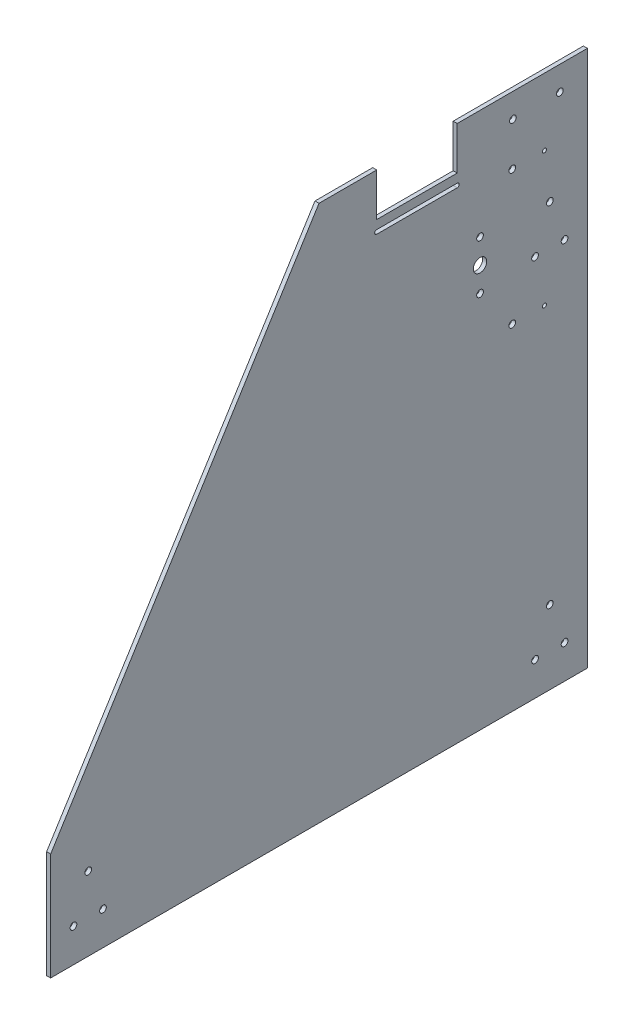
ISO-10303-21;
HEADER;
FILE_DESCRIPTION(('STEP AP214'),'2;1');
FILE_NAME('part.step','',(''),(''),'','','');
FILE_SCHEMA(('AUTOMOTIVE_DESIGN { 1 0 10303 214 1 1 1 1 }'));
ENDSEC;
DATA;
#1=APPLICATION_CONTEXT('core data for automotive mechanical design processes');
#2=APPLICATION_PROTOCOL_DEFINITION('international standard','automotive_design',2000,#1);
#3=PRODUCT_CONTEXT('',#1,'mechanical');
#4=PRODUCT('Part','Part','',(#3));
#5=PRODUCT_RELATED_PRODUCT_CATEGORY('part','',(#4));
#6=PRODUCT_DEFINITION_FORMATION('','',#4);
#7=PRODUCT_DEFINITION_CONTEXT('part definition',#1,'design');
#8=PRODUCT_DEFINITION('design','',#6,#7);
#9=PRODUCT_DEFINITION_SHAPE('','',#8);
#10=(LENGTH_UNIT() NAMED_UNIT(*) SI_UNIT(.MILLI.,.METRE.));
#11=(NAMED_UNIT(*) PLANE_ANGLE_UNIT() SI_UNIT($,.RADIAN.));
#12=(NAMED_UNIT(*) SI_UNIT($,.STERADIAN.) SOLID_ANGLE_UNIT());
#13=UNCERTAINTY_MEASURE_WITH_UNIT(LENGTH_MEASURE(1.E-05),#10,'distance_accuracy_value','');
#14=(GEOMETRIC_REPRESENTATION_CONTEXT(3) GLOBAL_UNCERTAINTY_ASSIGNED_CONTEXT((#13)) GLOBAL_UNIT_ASSIGNED_CONTEXT((#10,
#11,#12)) REPRESENTATION_CONTEXT('',''));
#15=CARTESIAN_POINT('',(0.,0.,0.));
#16=DIRECTION('',(0.,0.,1.));
#17=DIRECTION('',(1.,0.,0.));
#18=AXIS2_PLACEMENT_3D('',#15,#16,#17);
#19=CARTESIAN_POINT('',(5.,400.,-200.));
#20=DIRECTION('',(0.,1.,0.));
#21=DIRECTION('',(0.,0.,1.));
#22=AXIS2_PLACEMENT_3D('',#19,#20,#21);
#23=PLANE('',#22);
#24=DIRECTION('',(1.,0.,0.));
#25=VECTOR('',#24,1.);
#26=CARTESIAN_POINT('',(2.,400.,-303.));
#27=LINE('',#26,#25);
#28=CARTESIAN_POINT('',(2.,400.,-303.));
#29=VERTEX_POINT('',#28);
#30=CARTESIAN_POINT('',(5.,400.,-303.));
#31=VERTEX_POINT('',#30);
#32=EDGE_CURVE('E133',#29,#31,#27,.T.);
#33=ORIENTED_EDGE('',*,*,#32,.T.);
#34=DIRECTION('',(0.,0.,1.));
#35=VECTOR('',#34,1.);
#36=CARTESIAN_POINT('',(5.,400.,-200.));
#37=LINE('',#36,#35);
#38=CARTESIAN_POINT('',(5.,400.,-400.));
#39=VERTEX_POINT('',#38);
#40=EDGE_CURVE('E193',#39,#31,#37,.T.);
#41=ORIENTED_EDGE('',*,*,#40,.F.);
#42=DIRECTION('',(1.,0.,0.));
#43=VECTOR('',#42,1.);
#44=CARTESIAN_POINT('',(5.,400.,-400.));
#45=LINE('',#44,#43);
#46=CARTESIAN_POINT('',(2.,400.,-400.));
#47=VERTEX_POINT('',#46);
#48=EDGE_CURVE('E47',#47,#39,#45,.T.);
#49=ORIENTED_EDGE('',*,*,#48,.F.);
#50=DIRECTION('',(0.,0.,-1.));
#51=VECTOR('',#50,1.);
#52=CARTESIAN_POINT('',(2.,400.,0.));
#53=LINE('',#52,#51);
#54=EDGE_CURVE('E150',#47,#29,#53,.F.);
#55=ORIENTED_EDGE('',*,*,#54,.T.);
#56=EDGE_LOOP('',(#33,#41,#49,#55));
#57=FACE_BOUND('',#56,.T.);
#58=ADVANCED_FACE('F38',(#57),#23,.T.);
#59=CARTESIAN_POINT('',(5.,0.,-400.));
#60=DIRECTION('',(0.,0.,-1.));
#61=DIRECTION('',(0.,1.,0.));
#62=AXIS2_PLACEMENT_3D('',#59,#60,#61);
#63=PLANE('',#62);
#64=DIRECTION('',(1.,0.,0.));
#65=VECTOR('',#64,1.);
#66=CARTESIAN_POINT('',(5.,0.,-400.));
#67=LINE('',#66,#65);
#68=CARTESIAN_POINT('',(2.,0.,-400.));
#69=VERTEX_POINT('',#68);
#70=CARTESIAN_POINT('',(5.,0.,-400.));
#71=VERTEX_POINT('',#70);
#72=EDGE_CURVE('E11',#69,#71,#67,.T.);
#73=ORIENTED_EDGE('',*,*,#72,.F.);
#74=DIRECTION('',(0.,1.,0.));
#75=VECTOR('',#74,1.);
#76=CARTESIAN_POINT('',(2.,0.,-400.));
#77=LINE('',#76,#75);
#78=EDGE_CURVE('E162',#69,#47,#77,.T.);
#79=ORIENTED_EDGE('',*,*,#78,.T.);
#80=ORIENTED_EDGE('',*,*,#48,.T.);
#81=DIRECTION('',(0.,1.,0.));
#82=VECTOR('',#81,1.);
#83=CARTESIAN_POINT('',(5.,0.,-400.));
#84=LINE('',#83,#82);
#85=EDGE_CURVE('E188',#71,#39,#84,.T.);
#86=ORIENTED_EDGE('',*,*,#85,.F.);
#87=EDGE_LOOP('',(#73,#79,#80,#86));
#88=FACE_BOUND('',#87,.T.);
#89=ADVANCED_FACE('F187',(#88),#63,.T.);
#90=DIRECTION('',(1.,0.,0.));
#91=VECTOR('',#90,1.);
#92=CARTESIAN_POINT('',(2.,400.,-243.));
#93=LINE('',#92,#91);
#94=CARTESIAN_POINT('',(2.,400.,-243.));
#95=VERTEX_POINT('',#94);
#96=CARTESIAN_POINT('',(5.,400.,-243.));
#97=VERTEX_POINT('',#96);
#98=EDGE_CURVE('E143',#95,#97,#93,.T.);
#99=ORIENTED_EDGE('',*,*,#98,.F.);
#100=CARTESIAN_POINT('',(2.,400.,-200.));
#101=VERTEX_POINT('',#100);
#102=EDGE_CURVE('E157',#95,#101,#53,.F.);
#103=ORIENTED_EDGE('',*,*,#102,.T.);
#104=DIRECTION('',(1.,0.,0.));
#105=VECTOR('',#104,1.);
#106=CARTESIAN_POINT('',(5.,400.,-200.));
#107=LINE('',#106,#105);
#108=CARTESIAN_POINT('',(5.,400.,-200.));
#109=VERTEX_POINT('',#108);
#110=EDGE_CURVE('E181',#101,#109,#107,.T.);
#111=ORIENTED_EDGE('',*,*,#110,.T.);
#112=EDGE_CURVE('E197',#97,#109,#37,.T.);
#113=ORIENTED_EDGE('',*,*,#112,.F.);
#114=EDGE_LOOP('',(#99,#103,#111,#113));
#115=FACE_BOUND('',#114,.T.);
#116=ADVANCED_FACE('F235',(#115),#23,.T.);
#117=CARTESIAN_POINT('',(5.,80.,0.));
#118=DIRECTION('',(0.,0.52999894000318,0.847998304005088));
#119=DIRECTION('',(0.,-0.847998304005088,0.52999894000318));
#120=AXIS2_PLACEMENT_3D('',#117,#118,#119);
#121=PLANE('',#120);
#122=ORIENTED_EDGE('',*,*,#110,.F.);
#123=DIRECTION('',(0.,-0.847998304005088,0.52999894000318));
#124=VECTOR('',#123,1.);
#125=CARTESIAN_POINT('',(2.,80.,0.));
#126=LINE('',#125,#124);
#127=CARTESIAN_POINT('',(2.,80.,0.));
#128=VERTEX_POINT('',#127);
#129=EDGE_CURVE('E156',#101,#128,#126,.T.);
#130=ORIENTED_EDGE('',*,*,#129,.T.);
#131=DIRECTION('',(1.,0.,0.));
#132=VECTOR('',#131,1.);
#133=CARTESIAN_POINT('',(5.,80.,0.));
#134=LINE('',#133,#132);
#135=CARTESIAN_POINT('',(5.,80.,0.));
#136=VERTEX_POINT('',#135);
#137=EDGE_CURVE('E179',#128,#136,#134,.T.);
#138=ORIENTED_EDGE('',*,*,#137,.T.);
#139=DIRECTION('',(0.,-0.847998304005088,0.52999894000318));
#140=VECTOR('',#139,1.);
#141=CARTESIAN_POINT('',(5.,80.,0.));
#142=LINE('',#141,#140);
#143=EDGE_CURVE('E199',#109,#136,#142,.T.);
#144=ORIENTED_EDGE('',*,*,#143,.F.);
#145=EDGE_LOOP('',(#122,#130,#138,#144));
#146=FACE_BOUND('',#145,.T.);
#147=ADVANCED_FACE('F230',(#146),#121,.T.);
#148=CARTESIAN_POINT('',(5.,80.,0.));
#149=DIRECTION('',(0.,0.,1.));
#150=DIRECTION('',(0.,-1.,0.));
#151=AXIS2_PLACEMENT_3D('',#148,#149,#150);
#152=PLANE('',#151);
#153=ORIENTED_EDGE('',*,*,#137,.F.);
#154=DIRECTION('',(0.,1.,0.));
#155=VECTOR('',#154,1.);
#156=CARTESIAN_POINT('',(2.,0.,0.));
#157=LINE('',#156,#155);
#158=CARTESIAN_POINT('',(2.,0.,0.));
#159=VERTEX_POINT('',#158);
#160=EDGE_CURVE('E169',#128,#159,#157,.F.);
#161=ORIENTED_EDGE('',*,*,#160,.T.);
#162=DIRECTION('',(1.,0.,0.));
#163=VECTOR('',#162,1.);
#164=CARTESIAN_POINT('',(5.,0.,0.));
#165=LINE('',#164,#163);
#166=CARTESIAN_POINT('',(5.,0.,0.));
#167=VERTEX_POINT('',#166);
#168=EDGE_CURVE('E42',#159,#167,#165,.T.);
#169=ORIENTED_EDGE('',*,*,#168,.T.);
#170=DIRECTION('',(0.,-1.,0.));
#171=VECTOR('',#170,1.);
#172=CARTESIAN_POINT('',(5.,80.,0.));
#173=LINE('',#172,#171);
#174=EDGE_CURVE('E363',#136,#167,#173,.T.);
#175=ORIENTED_EDGE('',*,*,#174,.F.);
#176=EDGE_LOOP('',(#153,#161,#169,#175));
#177=FACE_BOUND('',#176,.T.);
#178=ADVANCED_FACE('F223',(#177),#152,.T.);
#179=CARTESIAN_POINT('',(5.,250.,-344.));
#180=DIRECTION('',(1.,0.,0.));
#181=DIRECTION('',(0.,0.,-1.));
#182=AXIS2_PLACEMENT_3D('',#179,#180,#181);
#183=CYLINDRICAL_SURFACE('',#182,2.50000000000002);
#184=CARTESIAN_POINT('',(5.,250.,-344.));
#185=DIRECTION('',(1.,0.,0.));
#186=DIRECTION('',(0.,0.,-1.));
#187=AXIS2_PLACEMENT_3D('',#184,#185,#186);
#188=CIRCLE('',#187,2.50000000000002);
#189=CARTESIAN_POINT('',(5.,250.,-346.5));
#190=VERTEX_POINT('',#189);
#191=EDGE_CURVE('E178',#190,#190,#188,.T.);
#192=ORIENTED_EDGE('',*,*,#191,.T.);
#193=EDGE_LOOP('',(#192));
#194=FACE_BOUND('',#193,.T.);
#195=CARTESIAN_POINT('',(2.,250.,-344.));
#196=DIRECTION('',(1.,0.,0.));
#197=DIRECTION('',(0.,0.,-1.));
#198=AXIS2_PLACEMENT_3D('',#195,#196,#197);
#199=CIRCLE('',#198,2.50000000000002);
#200=CARTESIAN_POINT('',(2.,250.,-346.5));
#201=VERTEX_POINT('',#200);
#202=EDGE_CURVE('E214',#201,#201,#199,.T.);
#203=ORIENTED_EDGE('',*,*,#202,.F.);
#204=EDGE_LOOP('',(#203));
#205=FACE_BOUND('',#204,.T.);
#206=ADVANCED_FACE('F377',(#194,#205),#183,.F.);
#207=CARTESIAN_POINT('',(5.,281.75,-320.));
#208=DIRECTION('',(1.,0.,0.));
#209=DIRECTION('',(0.,0.,-1.));
#210=AXIS2_PLACEMENT_3D('',#207,#208,#209);
#211=CYLINDRICAL_SURFACE('',#210,2.50000000000002);
#212=CARTESIAN_POINT('',(5.,281.75,-320.));
#213=DIRECTION('',(1.,0.,0.));
#214=DIRECTION('',(0.,0.,1.));
#215=AXIS2_PLACEMENT_3D('',#212,#213,#214);
#216=CIRCLE('',#215,2.50000000000002);
#217=CARTESIAN_POINT('',(5.,281.75,-317.5));
#218=VERTEX_POINT('',#217);
#219=EDGE_CURVE('E360',#218,#218,#216,.T.);
#220=ORIENTED_EDGE('',*,*,#219,.T.);
#221=EDGE_LOOP('',(#220));
#222=FACE_BOUND('',#221,.T.);
#223=CARTESIAN_POINT('',(2.,281.75,-320.));
#224=DIRECTION('',(1.,0.,0.));
#225=DIRECTION('',(0.,0.,-1.));
#226=AXIS2_PLACEMENT_3D('',#223,#224,#225);
#227=CIRCLE('',#226,2.50000000000002);
#228=CARTESIAN_POINT('',(2.,281.75,-322.5));
#229=VERTEX_POINT('',#228);
#230=EDGE_CURVE('E217',#229,#229,#227,.T.);
#231=ORIENTED_EDGE('',*,*,#230,.F.);
#232=EDGE_LOOP('',(#231));
#233=FACE_BOUND('',#232,.T.);
#234=ADVANCED_FACE('F368',(#222,#233),#211,.F.);
#235=CARTESIAN_POINT('',(5.,0.,0.));
#236=DIRECTION('',(0.,-1.,0.));
#237=DIRECTION('',(0.,0.,-1.));
#238=AXIS2_PLACEMENT_3D('',#235,#236,#237);
#239=PLANE('',#238);
#240=DIRECTION('',(0.,0.,-1.));
#241=VECTOR('',#240,1.);
#242=CARTESIAN_POINT('',(2.,0.,0.));
#243=LINE('',#242,#241);
#244=EDGE_CURVE('E166',#159,#69,#243,.T.);
#245=ORIENTED_EDGE('',*,*,#244,.T.);
#246=ORIENTED_EDGE('',*,*,#72,.T.);
#247=DIRECTION('',(0.,0.,-1.));
#248=VECTOR('',#247,1.);
#249=CARTESIAN_POINT('',(5.,0.,0.));
#250=LINE('',#249,#248);
#251=EDGE_CURVE('E196',#167,#71,#250,.T.);
#252=ORIENTED_EDGE('',*,*,#251,.F.);
#253=ORIENTED_EDGE('',*,*,#168,.F.);
#254=EDGE_LOOP('',(#245,#246,#252,#253));
#255=FACE_BOUND('',#254,.T.);
#256=ADVANCED_FACE('F365',(#255),#239,.T.);
#257=CARTESIAN_POINT('',(5.,318.25,-320.));
#258=DIRECTION('',(1.,0.,0.));
#259=DIRECTION('',(0.,0.,-1.));
#260=AXIS2_PLACEMENT_3D('',#257,#258,#259);
#261=CYLINDRICAL_SURFACE('',#260,2.50000000000002);
#262=CARTESIAN_POINT('',(5.,318.25,-320.));
#263=DIRECTION('',(1.,0.,0.));
#264=DIRECTION('',(0.,0.,-1.));
#265=AXIS2_PLACEMENT_3D('',#262,#263,#264);
#266=CIRCLE('',#265,2.50000000000002);
#267=CARTESIAN_POINT('',(5.,318.25,-322.5));
#268=VERTEX_POINT('',#267);
#269=EDGE_CURVE('E202',#268,#268,#266,.T.);
#270=ORIENTED_EDGE('',*,*,#269,.T.);
#271=EDGE_LOOP('',(#270));
#272=FACE_BOUND('',#271,.T.);
#273=CARTESIAN_POINT('',(2.,318.25,-320.));
#274=DIRECTION('',(1.,0.,0.));
#275=DIRECTION('',(0.,0.,-1.));
#276=AXIS2_PLACEMENT_3D('',#273,#274,#275);
#277=CIRCLE('',#276,2.50000000000002);
#278=CARTESIAN_POINT('',(2.,318.25,-322.5));
#279=VERTEX_POINT('',#278);
#280=EDGE_CURVE('E160',#279,#279,#277,.T.);
#281=ORIENTED_EDGE('',*,*,#280,.F.);
#282=EDGE_LOOP('',(#281));
#283=FACE_BOUND('',#282,.T.);
#284=ADVANCED_FACE('F367',(#272,#283),#261,.F.);
#285=CARTESIAN_POINT('',(5.,350.,-344.));
#286=DIRECTION('',(1.,0.,0.));
#287=DIRECTION('',(0.,0.,-1.));
#288=AXIS2_PLACEMENT_3D('',#285,#286,#287);
#289=CYLINDRICAL_SURFACE('',#288,2.50000000000002);
#290=CARTESIAN_POINT('',(5.,350.,-344.));
#291=DIRECTION('',(1.,0.,0.));
#292=DIRECTION('',(0.,0.,-1.));
#293=AXIS2_PLACEMENT_3D('',#290,#291,#292);
#294=CIRCLE('',#293,2.50000000000002);
#295=CARTESIAN_POINT('',(5.,350.,-346.5));
#296=VERTEX_POINT('',#295);
#297=EDGE_CURVE('E208',#296,#296,#294,.T.);
#298=ORIENTED_EDGE('',*,*,#297,.T.);
#299=EDGE_LOOP('',(#298));
#300=FACE_BOUND('',#299,.T.);
#301=CARTESIAN_POINT('',(2.,350.,-344.));
#302=DIRECTION('',(1.,0.,0.));
#303=DIRECTION('',(0.,0.,-1.));
#304=AXIS2_PLACEMENT_3D('',#301,#302,#303);
#305=CIRCLE('',#304,2.50000000000002);
#306=CARTESIAN_POINT('',(2.,350.,-346.5));
#307=VERTEX_POINT('',#306);
#308=EDGE_CURVE('E172',#307,#307,#305,.T.);
#309=ORIENTED_EDGE('',*,*,#308,.F.);
#310=EDGE_LOOP('',(#309));
#311=FACE_BOUND('',#310,.T.);
#312=ADVANCED_FACE('F374',(#300,#311),#289,.F.);
#313=CARTESIAN_POINT('',(5.,300.,-320.));
#314=DIRECTION('',(1.,0.,0.));
#315=DIRECTION('',(0.,0.,-1.));
#316=AXIS2_PLACEMENT_3D('',#313,#314,#315);
#317=CYLINDRICAL_SURFACE('',#316,4.99999999999999);
#318=CARTESIAN_POINT('',(5.,300.,-320.));
#319=DIRECTION('',(1.,0.,0.));
#320=DIRECTION('',(0.,0.,-1.));
#321=AXIS2_PLACEMENT_3D('',#318,#319,#320);
#322=CIRCLE('',#321,4.99999999999999);
#323=CARTESIAN_POINT('',(5.,300.,-325.));
#324=VERTEX_POINT('',#323);
#325=EDGE_CURVE('E211',#324,#324,#322,.T.);
#326=ORIENTED_EDGE('',*,*,#325,.T.);
#327=EDGE_LOOP('',(#326));
#328=FACE_BOUND('',#327,.T.);
#329=CARTESIAN_POINT('',(2.,300.,-320.));
#330=DIRECTION('',(1.,0.,0.));
#331=DIRECTION('',(0.,0.,-1.));
#332=AXIS2_PLACEMENT_3D('',#329,#330,#331);
#333=CIRCLE('',#332,4.99999999999999);
#334=CARTESIAN_POINT('',(2.,300.,-325.));
#335=VERTEX_POINT('',#334);
#336=EDGE_CURVE('E175',#335,#335,#333,.T.);
#337=ORIENTED_EDGE('',*,*,#336,.F.);
#338=EDGE_LOOP('',(#337));
#339=FACE_BOUND('',#338,.T.);
#340=ADVANCED_FACE('F40',(#328,#339),#317,.F.);
#341=CARTESIAN_POINT('',(5.,0.,0.));
#342=DIRECTION('',(1.,0.,0.));
#343=DIRECTION('',(0.,0.,-1.));
#344=AXIS2_PLACEMENT_3D('',#341,#342,#343);
#345=PLANE('',#344);
#346=DIRECTION('',(0.,1.,0.));
#347=VECTOR('',#346,1.);
#348=CARTESIAN_POINT('',(5.,368.,-303.));
#349=LINE('',#348,#347);
#350=CARTESIAN_POINT('',(5.,368.,-303.));
#351=VERTEX_POINT('',#350);
#352=EDGE_CURVE('E138',#351,#31,#349,.T.);
#353=ORIENTED_EDGE('',*,*,#352,.F.);
#354=DIRECTION('',(0.,0.,-1.));
#355=VECTOR('',#354,1.);
#356=CARTESIAN_POINT('',(5.,368.,-303.));
#357=LINE('',#356,#355);
#358=CARTESIAN_POINT('',(5.,368.,-243.));
#359=VERTEX_POINT('',#358);
#360=EDGE_CURVE('E154',#359,#351,#357,.T.);
#361=ORIENTED_EDGE('',*,*,#360,.F.);
#362=DIRECTION('',(0.,-1.,0.));
#363=VECTOR('',#362,1.);
#364=CARTESIAN_POINT('',(5.,368.,-243.));
#365=LINE('',#364,#363);
#366=EDGE_CURVE('E241',#97,#359,#365,.T.);
#367=ORIENTED_EDGE('',*,*,#366,.F.);
#368=ORIENTED_EDGE('',*,*,#112,.T.);
#369=ORIENTED_EDGE('',*,*,#143,.T.);
#370=ORIENTED_EDGE('',*,*,#174,.T.);
#371=ORIENTED_EDGE('',*,*,#251,.T.);
#372=ORIENTED_EDGE('',*,*,#85,.T.);
#373=ORIENTED_EDGE('',*,*,#40,.T.);
#374=EDGE_LOOP('',(#353,#361,#367,#368,#369,#370,#371,#372,#373));
#375=FACE_BOUND('',#374,.T.);
#376=CARTESIAN_POINT('',(5.,360.,-243.));
#377=DIRECTION('',(1.,0.,0.));
#378=DIRECTION('',(0.,0.,-1.));
#379=AXIS2_PLACEMENT_3D('',#376,#377,#378);
#380=CIRCLE('',#379,1.5);
#381=CARTESIAN_POINT('',(5.,361.5,-243.));
#382=VERTEX_POINT('',#381);
#383=CARTESIAN_POINT('',(5.,358.5,-243.));
#384=VERTEX_POINT('',#383);
#385=EDGE_CURVE('E54',#382,#384,#380,.T.);
#386=ORIENTED_EDGE('',*,*,#385,.F.);
#387=DIRECTION('',(0.,0.,1.));
#388=VECTOR('',#387,1.);
#389=CARTESIAN_POINT('',(5.,361.5,-243.));
#390=LINE('',#389,#388);
#391=CARTESIAN_POINT('',(5.,361.5,-303.));
#392=VERTEX_POINT('',#391);
#393=EDGE_CURVE('E257',#392,#382,#390,.T.);
#394=ORIENTED_EDGE('',*,*,#393,.F.);
#395=CARTESIAN_POINT('',(5.,360.,-303.));
#396=DIRECTION('',(1.,0.,0.));
#397=DIRECTION('',(0.,0.,-1.));
#398=AXIS2_PLACEMENT_3D('',#395,#396,#397);
#399=CIRCLE('',#398,1.5);
#400=CARTESIAN_POINT('',(5.,358.5,-303.));
#401=VERTEX_POINT('',#400);
#402=EDGE_CURVE('E271',#401,#392,#399,.T.);
#403=ORIENTED_EDGE('',*,*,#402,.F.);
#404=DIRECTION('',(0.,0.,-1.));
#405=VECTOR('',#404,1.);
#406=CARTESIAN_POINT('',(5.,358.5,-243.));
#407=LINE('',#406,#405);
#408=EDGE_CURVE('E268',#384,#401,#407,.T.);
#409=ORIENTED_EDGE('',*,*,#408,.F.);
#410=EDGE_LOOP('',(#386,#394,#403,#409));
#411=FACE_BOUND('',#410,.T.);
#412=CARTESIAN_POINT('',(5.,349.999999999988,-368.000000000012));
#413=DIRECTION('',(-1.,0.,0.));
#414=DIRECTION('',(0.,0.,1.));
#415=AXIS2_PLACEMENT_3D('',#412,#413,#414);
#416=CIRCLE('',#415,1.50000000000002);
#417=CARTESIAN_POINT('',(5.,349.999999999988,-366.500000000012));
#418=VERTEX_POINT('',#417);
#419=EDGE_CURVE('E282',#418,#418,#416,.T.);
#420=ORIENTED_EDGE('',*,*,#419,.T.);
#421=EDGE_LOOP('',(#420));
#422=FACE_BOUND('',#421,.T.);
#423=CARTESIAN_POINT('',(5.,249.999999999988,-368.000000000009));
#424=DIRECTION('',(-1.,0.,0.));
#425=DIRECTION('',(0.,0.,1.));
#426=AXIS2_PLACEMENT_3D('',#423,#424,#425);
#427=CIRCLE('',#426,1.50000000000002);
#428=CARTESIAN_POINT('',(5.,249.999999999988,-366.500000000009));
#429=VERTEX_POINT('',#428);
#430=EDGE_CURVE('E289',#429,#429,#427,.T.);
#431=ORIENTED_EDGE('',*,*,#430,.T.);
#432=EDGE_LOOP('',(#431));
#433=FACE_BOUND('',#432,.T.);
#434=CARTESIAN_POINT('',(5.,382.,-344.499999999998));
#435=DIRECTION('',(-1.,0.,0.));
#436=DIRECTION('',(0.,0.,1.));
#437=AXIS2_PLACEMENT_3D('',#434,#435,#436);
#438=CIRCLE('',#437,2.50000000000002);
#439=CARTESIAN_POINT('',(5.,382.,-341.999999999998));
#440=VERTEX_POINT('',#439);
#441=EDGE_CURVE('E294',#440,#440,#438,.T.);
#442=ORIENTED_EDGE('',*,*,#441,.T.);
#443=EDGE_LOOP('',(#442));
#444=FACE_BOUND('',#443,.T.);
#445=CARTESIAN_POINT('',(5.,382.,-379.499999999998));
#446=DIRECTION('',(-1.,0.,0.));
#447=DIRECTION('',(0.,0.,1.));
#448=AXIS2_PLACEMENT_3D('',#445,#446,#447);
#449=CIRCLE('',#448,2.50000000000002);
#450=CARTESIAN_POINT('',(5.,382.,-376.999999999998));
#451=VERTEX_POINT('',#450);
#452=EDGE_CURVE('E301',#451,#451,#449,.T.);
#453=ORIENTED_EDGE('',*,*,#452,.T.);
#454=EDGE_LOOP('',(#453));
#455=FACE_BOUND('',#454,.T.);
#456=CARTESIAN_POINT('',(5.,315.,-371.999999999997));
#457=DIRECTION('',(-1.,0.,0.));
#458=DIRECTION('',(0.,0.,1.));
#459=AXIS2_PLACEMENT_3D('',#456,#457,#458);
#460=CIRCLE('',#459,2.49999999999997);
#461=CARTESIAN_POINT('',(5.,315.,-369.499999999997));
#462=VERTEX_POINT('',#461);
#463=EDGE_CURVE('E306',#462,#462,#460,.T.);
#464=ORIENTED_EDGE('',*,*,#463,.T.);
#465=EDGE_LOOP('',(#464));
#466=FACE_BOUND('',#465,.T.);
#467=CARTESIAN_POINT('',(5.,285.,-360.999999999997));
#468=DIRECTION('',(-1.,0.,0.));
#469=DIRECTION('',(0.,0.,1.));
#470=AXIS2_PLACEMENT_3D('',#467,#468,#469);
#471=CIRCLE('',#470,2.49999999999997);
#472=CARTESIAN_POINT('',(5.,285.,-358.499999999997));
#473=VERTEX_POINT('',#472);
#474=EDGE_CURVE('E313',#473,#473,#471,.T.);
#475=ORIENTED_EDGE('',*,*,#474,.T.);
#476=EDGE_LOOP('',(#475));
#477=FACE_BOUND('',#476,.T.);
#478=CARTESIAN_POINT('',(5.,285.,-382.999999999997));
#479=DIRECTION('',(-1.,0.,0.));
#480=DIRECTION('',(0.,0.,-1.));
#481=AXIS2_PLACEMENT_3D('',#478,#479,#480);
#482=CIRCLE('',#481,2.49999999999997);
#483=CARTESIAN_POINT('',(5.,285.,-385.499999999997));
#484=VERTEX_POINT('',#483);
#485=EDGE_CURVE('E319',#484,#484,#482,.T.);
#486=ORIENTED_EDGE('',*,*,#485,.T.);
#487=EDGE_LOOP('',(#486));
#488=FACE_BOUND('',#487,.T.);
#489=CARTESIAN_POINT('',(5.,55.0000000000013,-372.000000000005));
#490=DIRECTION('',(1.,0.,0.));
#491=DIRECTION('',(0.,0.,1.));
#492=AXIS2_PLACEMENT_3D('',#489,#490,#491);
#493=CIRCLE('',#492,2.49999999999997);
#494=CARTESIAN_POINT('',(5.,55.0000000000013,-369.500000000005));
#495=VERTEX_POINT('',#494);
#496=EDGE_CURVE('E309',#495,#495,#493,.T.);
#497=ORIENTED_EDGE('',*,*,#496,.F.);
#498=EDGE_LOOP('',(#497));
#499=FACE_BOUND('',#498,.T.);
#500=CARTESIAN_POINT('',(5.,25.0000000000014,-361.000000000005));
#501=DIRECTION('',(1.,0.,0.));
#502=DIRECTION('',(0.,0.,1.));
#503=AXIS2_PLACEMENT_3D('',#500,#501,#502);
#504=CIRCLE('',#503,2.49999999999984);
#505=CARTESIAN_POINT('',(5.,25.0000000000014,-358.500000000005));
#506=VERTEX_POINT('',#505);
#507=EDGE_CURVE('E346',#506,#506,#504,.T.);
#508=ORIENTED_EDGE('',*,*,#507,.F.);
#509=EDGE_LOOP('',(#508));
#510=FACE_BOUND('',#509,.T.);
#511=CARTESIAN_POINT('',(5.,25.0000000000014,-383.000000000005));
#512=DIRECTION('',(1.,0.,0.));
#513=DIRECTION('',(0.,0.,-1.));
#514=AXIS2_PLACEMENT_3D('',#511,#512,#513);
#515=CIRCLE('',#514,2.49999999999997);
#516=CARTESIAN_POINT('',(5.,25.0000000000014,-385.500000000005));
#517=VERTEX_POINT('',#516);
#518=EDGE_CURVE('E340',#517,#517,#515,.T.);
#519=ORIENTED_EDGE('',*,*,#518,.F.);
#520=EDGE_LOOP('',(#519));
#521=FACE_BOUND('',#520,.T.);
#522=CARTESIAN_POINT('',(5.,25.,-16.9999999999951));
#523=DIRECTION('',(1.,0.,0.));
#524=DIRECTION('',(0.,0.,1.));
#525=AXIS2_PLACEMENT_3D('',#522,#523,#524);
#526=CIRCLE('',#525,2.50000000000001);
#527=CARTESIAN_POINT('',(5.,25.,-14.4999999999951));
#528=VERTEX_POINT('',#527);
#529=EDGE_CURVE('E334',#528,#528,#526,.T.);
#530=ORIENTED_EDGE('',*,*,#529,.F.);
#531=EDGE_LOOP('',(#530));
#532=FACE_BOUND('',#531,.T.);
#533=CARTESIAN_POINT('',(5.,25.,-38.9999999999949));
#534=DIRECTION('',(1.,0.,0.));
#535=DIRECTION('',(0.,0.,-1.));
#536=AXIS2_PLACEMENT_3D('',#533,#534,#535);
#537=CIRCLE('',#536,2.5);
#538=CARTESIAN_POINT('',(5.,25.,-41.4999999999949));
#539=VERTEX_POINT('',#538);
#540=EDGE_CURVE('E328',#539,#539,#537,.T.);
#541=ORIENTED_EDGE('',*,*,#540,.F.);
#542=EDGE_LOOP('',(#541));
#543=FACE_BOUND('',#542,.T.);
#544=CARTESIAN_POINT('',(5.,55.,-27.9999999999949));
#545=DIRECTION('',(1.,0.,0.));
#546=DIRECTION('',(0.,0.,-1.));
#547=AXIS2_PLACEMENT_3D('',#544,#545,#546);
#548=CIRCLE('',#547,2.5);
#549=CARTESIAN_POINT('',(5.,55.,-30.4999999999949));
#550=VERTEX_POINT('',#549);
#551=EDGE_CURVE('E327',#550,#550,#548,.T.);
#552=ORIENTED_EDGE('',*,*,#551,.F.);
#553=EDGE_LOOP('',(#552));
#554=FACE_BOUND('',#553,.T.);
#555=ORIENTED_EDGE('',*,*,#191,.F.);
#556=EDGE_LOOP('',(#555));
#557=FACE_BOUND('',#556,.T.);
#558=ORIENTED_EDGE('',*,*,#219,.F.);
#559=EDGE_LOOP('',(#558));
#560=FACE_BOUND('',#559,.T.);
#561=ORIENTED_EDGE('',*,*,#269,.F.);
#562=EDGE_LOOP('',(#561));
#563=FACE_BOUND('',#562,.T.);
#564=ORIENTED_EDGE('',*,*,#297,.F.);
#565=EDGE_LOOP('',(#564));
#566=FACE_BOUND('',#565,.T.);
#567=ORIENTED_EDGE('',*,*,#325,.F.);
#568=EDGE_LOOP('',(#567));
#569=FACE_BOUND('',#568,.T.);
#570=ADVANCED_FACE('F191',(#375,#411,#422,#433,#444,#455,#466,#477,#488,#499,#510,#521,#532,
#543,#554,#557,#560,#563,#566,#569),#345,.T.);
#571=CARTESIAN_POINT('',(2.,0.,0.));
#572=DIRECTION('',(1.,0.,0.));
#573=DIRECTION('',(0.,0.,-1.));
#574=AXIS2_PLACEMENT_3D('',#571,#572,#573);
#575=PLANE('',#574);
#576=DIRECTION('',(0.,0.,1.));
#577=VECTOR('',#576,1.);
#578=CARTESIAN_POINT('',(2.,361.5,-243.));
#579=LINE('',#578,#577);
#580=CARTESIAN_POINT('',(2.,361.5,-303.));
#581=VERTEX_POINT('',#580);
#582=CARTESIAN_POINT('',(2.,361.5,-243.));
#583=VERTEX_POINT('',#582);
#584=EDGE_CURVE('E263',#581,#583,#579,.T.);
#585=ORIENTED_EDGE('',*,*,#584,.T.);
#586=CARTESIAN_POINT('',(2.,360.,-243.));
#587=DIRECTION('',(1.,0.,0.));
#588=DIRECTION('',(0.,0.,-1.));
#589=AXIS2_PLACEMENT_3D('',#586,#587,#588);
#590=CIRCLE('',#589,1.5);
#591=CARTESIAN_POINT('',(2.,358.5,-243.));
#592=VERTEX_POINT('',#591);
#593=EDGE_CURVE('E253',#583,#592,#590,.T.);
#594=ORIENTED_EDGE('',*,*,#593,.T.);
#595=DIRECTION('',(0.,0.,-1.));
#596=VECTOR('',#595,1.);
#597=CARTESIAN_POINT('',(2.,358.5,-243.));
#598=LINE('',#597,#596);
#599=CARTESIAN_POINT('',(2.,358.5,-303.));
#600=VERTEX_POINT('',#599);
#601=EDGE_CURVE('E256',#592,#600,#598,.T.);
#602=ORIENTED_EDGE('',*,*,#601,.T.);
#603=CARTESIAN_POINT('',(2.,360.,-303.));
#604=DIRECTION('',(1.,0.,0.));
#605=DIRECTION('',(0.,0.,-1.));
#606=AXIS2_PLACEMENT_3D('',#603,#604,#605);
#607=CIRCLE('',#606,1.5);
#608=EDGE_CURVE('E260',#600,#581,#607,.T.);
#609=ORIENTED_EDGE('',*,*,#608,.T.);
#610=EDGE_LOOP('',(#585,#594,#602,#609));
#611=FACE_BOUND('',#610,.T.);
#612=CARTESIAN_POINT('',(2.,349.999999999988,-368.000000000012));
#613=DIRECTION('',(-1.,0.,0.));
#614=DIRECTION('',(0.,0.,1.));
#615=AXIS2_PLACEMENT_3D('',#612,#613,#614);
#616=CIRCLE('',#615,1.50000000000002);
#617=CARTESIAN_POINT('',(2.,349.999999999988,-366.500000000012));
#618=VERTEX_POINT('',#617);
#619=EDGE_CURVE('E286',#618,#618,#616,.T.);
#620=ORIENTED_EDGE('',*,*,#619,.F.);
#621=EDGE_LOOP('',(#620));
#622=FACE_BOUND('',#621,.T.);
#623=CARTESIAN_POINT('',(2.,249.999999999988,-368.000000000009));
#624=DIRECTION('',(-1.,0.,0.));
#625=DIRECTION('',(0.,0.,1.));
#626=AXIS2_PLACEMENT_3D('',#623,#624,#625);
#627=CIRCLE('',#626,1.50000000000002);
#628=CARTESIAN_POINT('',(2.,249.999999999988,-366.500000000009));
#629=VERTEX_POINT('',#628);
#630=EDGE_CURVE('E249',#629,#629,#627,.T.);
#631=ORIENTED_EDGE('',*,*,#630,.F.);
#632=EDGE_LOOP('',(#631));
#633=FACE_BOUND('',#632,.T.);
#634=CARTESIAN_POINT('',(2.,382.,-344.499999999998));
#635=DIRECTION('',(-1.,0.,0.));
#636=DIRECTION('',(0.,0.,1.));
#637=AXIS2_PLACEMENT_3D('',#634,#635,#636);
#638=CIRCLE('',#637,2.50000000000002);
#639=CARTESIAN_POINT('',(2.,382.,-341.999999999998));
#640=VERTEX_POINT('',#639);
#641=EDGE_CURVE('E298',#640,#640,#638,.T.);
#642=ORIENTED_EDGE('',*,*,#641,.F.);
#643=EDGE_LOOP('',(#642));
#644=FACE_BOUND('',#643,.T.);
#645=CARTESIAN_POINT('',(2.,382.,-379.499999999998));
#646=DIRECTION('',(-1.,0.,0.));
#647=DIRECTION('',(0.,0.,1.));
#648=AXIS2_PLACEMENT_3D('',#645,#646,#647);
#649=CIRCLE('',#648,2.50000000000002);
#650=CARTESIAN_POINT('',(2.,382.,-376.999999999998));
#651=VERTEX_POINT('',#650);
#652=EDGE_CURVE('E285',#651,#651,#649,.T.);
#653=ORIENTED_EDGE('',*,*,#652,.F.);
#654=EDGE_LOOP('',(#653));
#655=FACE_BOUND('',#654,.T.);
#656=CARTESIAN_POINT('',(2.,315.,-371.999999999997));
#657=DIRECTION('',(-1.,0.,0.));
#658=DIRECTION('',(0.,0.,1.));
#659=AXIS2_PLACEMENT_3D('',#656,#657,#658);
#660=CIRCLE('',#659,2.49999999999997);
#661=CARTESIAN_POINT('',(2.,315.,-369.499999999997));
#662=VERTEX_POINT('',#661);
#663=EDGE_CURVE('E310',#662,#662,#660,.T.);
#664=ORIENTED_EDGE('',*,*,#663,.F.);
#665=EDGE_LOOP('',(#664));
#666=FACE_BOUND('',#665,.T.);
#667=CARTESIAN_POINT('',(2.,285.,-360.999999999997));
#668=DIRECTION('',(-1.,0.,0.));
#669=DIRECTION('',(0.,0.,1.));
#670=AXIS2_PLACEMENT_3D('',#667,#668,#669);
#671=CIRCLE('',#670,2.49999999999997);
#672=CARTESIAN_POINT('',(2.,285.,-358.499999999997));
#673=VERTEX_POINT('',#672);
#674=EDGE_CURVE('E316',#673,#673,#671,.T.);
#675=ORIENTED_EDGE('',*,*,#674,.F.);
#676=EDGE_LOOP('',(#675));
#677=FACE_BOUND('',#676,.T.);
#678=CARTESIAN_POINT('',(2.,285.,-382.999999999997));
#679=DIRECTION('',(-1.,0.,0.));
#680=DIRECTION('',(0.,0.,-1.));
#681=AXIS2_PLACEMENT_3D('',#678,#679,#680);
#682=CIRCLE('',#681,2.49999999999997);
#683=CARTESIAN_POINT('',(2.,285.,-385.499999999997));
#684=VERTEX_POINT('',#683);
#685=EDGE_CURVE('E297',#684,#684,#682,.T.);
#686=ORIENTED_EDGE('',*,*,#685,.F.);
#687=EDGE_LOOP('',(#686));
#688=FACE_BOUND('',#687,.T.);
#689=CARTESIAN_POINT('',(2.,55.0000000000013,-372.000000000005));
#690=DIRECTION('',(1.,0.,0.));
#691=DIRECTION('',(0.,0.,1.));
#692=AXIS2_PLACEMENT_3D('',#689,#690,#691);
#693=CIRCLE('',#692,2.49999999999997);
#694=CARTESIAN_POINT('',(2.,55.0000000000013,-369.500000000005));
#695=VERTEX_POINT('',#694);
#696=EDGE_CURVE('E349',#695,#695,#693,.T.);
#697=ORIENTED_EDGE('',*,*,#696,.T.);
#698=EDGE_LOOP('',(#697));
#699=FACE_BOUND('',#698,.T.);
#700=CARTESIAN_POINT('',(2.,25.0000000000014,-361.000000000005));
#701=DIRECTION('',(1.,0.,0.));
#702=DIRECTION('',(0.,0.,1.));
#703=AXIS2_PLACEMENT_3D('',#700,#701,#702);
#704=CIRCLE('',#703,2.49999999999984);
#705=CARTESIAN_POINT('',(2.,25.0000000000014,-358.500000000005));
#706=VERTEX_POINT('',#705);
#707=EDGE_CURVE('E343',#706,#706,#704,.T.);
#708=ORIENTED_EDGE('',*,*,#707,.T.);
#709=EDGE_LOOP('',(#708));
#710=FACE_BOUND('',#709,.T.);
#711=CARTESIAN_POINT('',(2.,25.0000000000014,-383.000000000005));
#712=DIRECTION('',(1.,0.,0.));
#713=DIRECTION('',(0.,0.,-1.));
#714=AXIS2_PLACEMENT_3D('',#711,#712,#713);
#715=CIRCLE('',#714,2.49999999999997);
#716=CARTESIAN_POINT('',(2.,25.0000000000014,-385.500000000005));
#717=VERTEX_POINT('',#716);
#718=EDGE_CURVE('E337',#717,#717,#715,.T.);
#719=ORIENTED_EDGE('',*,*,#718,.T.);
#720=EDGE_LOOP('',(#719));
#721=FACE_BOUND('',#720,.T.);
#722=CARTESIAN_POINT('',(2.,25.,-16.9999999999951));
#723=DIRECTION('',(1.,0.,0.));
#724=DIRECTION('',(0.,0.,1.));
#725=AXIS2_PLACEMENT_3D('',#722,#723,#724);
#726=CIRCLE('',#725,2.50000000000001);
#727=CARTESIAN_POINT('',(2.,25.,-14.4999999999951));
#728=VERTEX_POINT('',#727);
#729=EDGE_CURVE('E331',#728,#728,#726,.T.);
#730=ORIENTED_EDGE('',*,*,#729,.T.);
#731=EDGE_LOOP('',(#730));
#732=FACE_BOUND('',#731,.T.);
#733=CARTESIAN_POINT('',(2.,25.,-38.9999999999949));
#734=DIRECTION('',(1.,0.,0.));
#735=DIRECTION('',(0.,0.,-1.));
#736=AXIS2_PLACEMENT_3D('',#733,#734,#735);
#737=CIRCLE('',#736,2.5);
#738=CARTESIAN_POINT('',(2.,25.,-41.4999999999949));
#739=VERTEX_POINT('',#738);
#740=EDGE_CURVE('E324',#739,#739,#737,.T.);
#741=ORIENTED_EDGE('',*,*,#740,.T.);
#742=EDGE_LOOP('',(#741));
#743=FACE_BOUND('',#742,.T.);
#744=CARTESIAN_POINT('',(2.,55.,-27.9999999999949));
#745=DIRECTION('',(1.,0.,0.));
#746=DIRECTION('',(0.,0.,-1.));
#747=AXIS2_PLACEMENT_3D('',#744,#745,#746);
#748=CIRCLE('',#747,2.5);
#749=CARTESIAN_POINT('',(2.,55.,-30.4999999999949));
#750=VERTEX_POINT('',#749);
#751=EDGE_CURVE('E218',#750,#750,#748,.T.);
#752=ORIENTED_EDGE('',*,*,#751,.T.);
#753=EDGE_LOOP('',(#752));
#754=FACE_BOUND('',#753,.T.);
#755=ORIENTED_EDGE('',*,*,#202,.T.);
#756=EDGE_LOOP('',(#755));
#757=FACE_BOUND('',#756,.T.);
#758=ORIENTED_EDGE('',*,*,#230,.T.);
#759=EDGE_LOOP('',(#758));
#760=FACE_BOUND('',#759,.T.);
#761=DIRECTION('',(0.,0.,-1.));
#762=VECTOR('',#761,1.);
#763=CARTESIAN_POINT('',(2.,368.,-303.));
#764=LINE('',#763,#762);
#765=CARTESIAN_POINT('',(2.,368.,-243.));
#766=VERTEX_POINT('',#765);
#767=CARTESIAN_POINT('',(2.,368.,-303.));
#768=VERTEX_POINT('',#767);
#769=EDGE_CURVE('E62',#766,#768,#764,.T.);
#770=ORIENTED_EDGE('',*,*,#769,.T.);
#771=DIRECTION('',(0.,1.,0.));
#772=VECTOR('',#771,1.);
#773=CARTESIAN_POINT('',(2.,368.,-303.));
#774=LINE('',#773,#772);
#775=EDGE_CURVE('E136',#768,#29,#774,.T.);
#776=ORIENTED_EDGE('',*,*,#775,.T.);
#777=ORIENTED_EDGE('',*,*,#54,.F.);
#778=ORIENTED_EDGE('',*,*,#78,.F.);
#779=ORIENTED_EDGE('',*,*,#244,.F.);
#780=ORIENTED_EDGE('',*,*,#160,.F.);
#781=ORIENTED_EDGE('',*,*,#129,.F.);
#782=ORIENTED_EDGE('',*,*,#102,.F.);
#783=DIRECTION('',(0.,-1.,0.));
#784=VECTOR('',#783,1.);
#785=CARTESIAN_POINT('',(2.,368.,-243.));
#786=LINE('',#785,#784);
#787=EDGE_CURVE('E153',#95,#766,#786,.T.);
#788=ORIENTED_EDGE('',*,*,#787,.T.);
#789=EDGE_LOOP('',(#770,#776,#777,#778,#779,#780,#781,#782,#788));
#790=FACE_BOUND('',#789,.T.);
#791=ORIENTED_EDGE('',*,*,#280,.T.);
#792=EDGE_LOOP('',(#791));
#793=FACE_BOUND('',#792,.T.);
#794=ORIENTED_EDGE('',*,*,#308,.T.);
#795=EDGE_LOOP('',(#794));
#796=FACE_BOUND('',#795,.T.);
#797=ORIENTED_EDGE('',*,*,#336,.T.);
#798=EDGE_LOOP('',(#797));
#799=FACE_BOUND('',#798,.T.);
#800=ADVANCED_FACE('F147',(#611,#622,#633,#644,#655,#666,#677,#688,#699,#710,#721,#732,#743,
#754,#757,#760,#790,#793,#796,#799),#575,.F.);
#801=CARTESIAN_POINT('',(2.,55.,-27.9999999999949));
#802=DIRECTION('',(1.,0.,0.));
#803=DIRECTION('',(0.,0.,-1.));
#804=AXIS2_PLACEMENT_3D('',#801,#802,#803);
#805=CYLINDRICAL_SURFACE('',#804,2.5);
#806=ORIENTED_EDGE('',*,*,#751,.F.);
#807=EDGE_LOOP('',(#806));
#808=FACE_BOUND('',#807,.T.);
#809=ORIENTED_EDGE('',*,*,#551,.T.);
#810=EDGE_LOOP('',(#809));
#811=FACE_BOUND('',#810,.T.);
#812=ADVANCED_FACE('F403',(#808,#811),#805,.F.);
#813=CARTESIAN_POINT('',(2.,25.,-38.9999999999949));
#814=DIRECTION('',(1.,0.,0.));
#815=DIRECTION('',(0.,0.,-1.));
#816=AXIS2_PLACEMENT_3D('',#813,#814,#815);
#817=CYLINDRICAL_SURFACE('',#816,2.5);
#818=ORIENTED_EDGE('',*,*,#740,.F.);
#819=EDGE_LOOP('',(#818));
#820=FACE_BOUND('',#819,.T.);
#821=ORIENTED_EDGE('',*,*,#540,.T.);
#822=EDGE_LOOP('',(#821));
#823=FACE_BOUND('',#822,.T.);
#824=ADVANCED_FACE('F408',(#820,#823),#817,.F.);
#825=CARTESIAN_POINT('',(2.,25.,-16.9999999999951));
#826=DIRECTION('',(1.,0.,0.));
#827=DIRECTION('',(0.,0.,-1.));
#828=AXIS2_PLACEMENT_3D('',#825,#826,#827);
#829=CYLINDRICAL_SURFACE('',#828,2.50000000000001);
#830=ORIENTED_EDGE('',*,*,#729,.F.);
#831=EDGE_LOOP('',(#830));
#832=FACE_BOUND('',#831,.T.);
#833=ORIENTED_EDGE('',*,*,#529,.T.);
#834=EDGE_LOOP('',(#833));
#835=FACE_BOUND('',#834,.T.);
#836=ADVANCED_FACE('F422',(#832,#835),#829,.F.);
#837=CARTESIAN_POINT('',(2.,25.0000000000014,-383.000000000005));
#838=DIRECTION('',(1.,0.,0.));
#839=DIRECTION('',(0.,0.,-1.));
#840=AXIS2_PLACEMENT_3D('',#837,#838,#839);
#841=CYLINDRICAL_SURFACE('',#840,2.49999999999997);
#842=ORIENTED_EDGE('',*,*,#718,.F.);
#843=EDGE_LOOP('',(#842));
#844=FACE_BOUND('',#843,.T.);
#845=ORIENTED_EDGE('',*,*,#518,.T.);
#846=EDGE_LOOP('',(#845));
#847=FACE_BOUND('',#846,.T.);
#848=ADVANCED_FACE('F418',(#844,#847),#841,.F.);
#849=CARTESIAN_POINT('',(2.,25.0000000000014,-361.000000000005));
#850=DIRECTION('',(1.,0.,0.));
#851=DIRECTION('',(0.,0.,-1.));
#852=AXIS2_PLACEMENT_3D('',#849,#850,#851);
#853=CYLINDRICAL_SURFACE('',#852,2.49999999999984);
#854=ORIENTED_EDGE('',*,*,#707,.F.);
#855=EDGE_LOOP('',(#854));
#856=FACE_BOUND('',#855,.T.);
#857=ORIENTED_EDGE('',*,*,#507,.T.);
#858=EDGE_LOOP('',(#857));
#859=FACE_BOUND('',#858,.T.);
#860=ADVANCED_FACE('F414',(#856,#859),#853,.F.);
#861=CARTESIAN_POINT('',(2.,55.0000000000013,-372.000000000005));
#862=DIRECTION('',(1.,0.,0.));
#863=DIRECTION('',(0.,0.,-1.));
#864=AXIS2_PLACEMENT_3D('',#861,#862,#863);
#865=CYLINDRICAL_SURFACE('',#864,2.49999999999997);
#866=ORIENTED_EDGE('',*,*,#696,.F.);
#867=EDGE_LOOP('',(#866));
#868=FACE_BOUND('',#867,.T.);
#869=ORIENTED_EDGE('',*,*,#496,.T.);
#870=EDGE_LOOP('',(#869));
#871=FACE_BOUND('',#870,.T.);
#872=ADVANCED_FACE('F410',(#868,#871),#865,.F.);
#873=CARTESIAN_POINT('',(5.,285.,-382.999999999997));
#874=DIRECTION('',(-1.,0.,0.));
#875=DIRECTION('',(0.,0.,1.));
#876=AXIS2_PLACEMENT_3D('',#873,#874,#875);
#877=CYLINDRICAL_SURFACE('',#876,2.49999999999997);
#878=ORIENTED_EDGE('',*,*,#485,.F.);
#879=EDGE_LOOP('',(#878));
#880=FACE_BOUND('',#879,.T.);
#881=ORIENTED_EDGE('',*,*,#685,.T.);
#882=EDGE_LOOP('',(#881));
#883=FACE_BOUND('',#882,.T.);
#884=ADVANCED_FACE('F413',(#880,#883),#877,.F.);
#885=CARTESIAN_POINT('',(5.,285.,-360.999999999997));
#886=DIRECTION('',(-1.,0.,0.));
#887=DIRECTION('',(0.,0.,1.));
#888=AXIS2_PLACEMENT_3D('',#885,#886,#887);
#889=CYLINDRICAL_SURFACE('',#888,2.49999999999997);
#890=ORIENTED_EDGE('',*,*,#474,.F.);
#891=EDGE_LOOP('',(#890));
#892=FACE_BOUND('',#891,.T.);
#893=ORIENTED_EDGE('',*,*,#674,.T.);
#894=EDGE_LOOP('',(#893));
#895=FACE_BOUND('',#894,.T.);
#896=ADVANCED_FACE('F432',(#892,#895),#889,.F.);
#897=CARTESIAN_POINT('',(5.,315.,-371.999999999997));
#898=DIRECTION('',(-1.,0.,0.));
#899=DIRECTION('',(0.,0.,1.));
#900=AXIS2_PLACEMENT_3D('',#897,#898,#899);
#901=CYLINDRICAL_SURFACE('',#900,2.49999999999997);
#902=ORIENTED_EDGE('',*,*,#463,.F.);
#903=EDGE_LOOP('',(#902));
#904=FACE_BOUND('',#903,.T.);
#905=ORIENTED_EDGE('',*,*,#663,.T.);
#906=EDGE_LOOP('',(#905));
#907=FACE_BOUND('',#906,.T.);
#908=ADVANCED_FACE('F436',(#904,#907),#901,.F.);
#909=CARTESIAN_POINT('',(5.,382.,-379.499999999998));
#910=DIRECTION('',(-1.,0.,0.));
#911=DIRECTION('',(0.,0.,1.));
#912=AXIS2_PLACEMENT_3D('',#909,#910,#911);
#913=CYLINDRICAL_SURFACE('',#912,2.50000000000002);
#914=ORIENTED_EDGE('',*,*,#452,.F.);
#915=EDGE_LOOP('',(#914));
#916=FACE_BOUND('',#915,.T.);
#917=ORIENTED_EDGE('',*,*,#652,.T.);
#918=EDGE_LOOP('',(#917));
#919=FACE_BOUND('',#918,.T.);
#920=ADVANCED_FACE('F440',(#916,#919),#913,.F.);
#921=CARTESIAN_POINT('',(5.,382.,-344.499999999998));
#922=DIRECTION('',(-1.,0.,0.));
#923=DIRECTION('',(0.,0.,1.));
#924=AXIS2_PLACEMENT_3D('',#921,#922,#923);
#925=CYLINDRICAL_SURFACE('',#924,2.50000000000002);
#926=ORIENTED_EDGE('',*,*,#441,.F.);
#927=EDGE_LOOP('',(#926));
#928=FACE_BOUND('',#927,.T.);
#929=ORIENTED_EDGE('',*,*,#641,.T.);
#930=EDGE_LOOP('',(#929));
#931=FACE_BOUND('',#930,.T.);
#932=ADVANCED_FACE('F444',(#928,#931),#925,.F.);
#933=CARTESIAN_POINT('',(5.,249.999999999988,-368.000000000009));
#934=DIRECTION('',(-1.,0.,0.));
#935=DIRECTION('',(0.,0.,1.));
#936=AXIS2_PLACEMENT_3D('',#933,#934,#935);
#937=CYLINDRICAL_SURFACE('',#936,1.50000000000002);
#938=ORIENTED_EDGE('',*,*,#430,.F.);
#939=EDGE_LOOP('',(#938));
#940=FACE_BOUND('',#939,.T.);
#941=ORIENTED_EDGE('',*,*,#630,.T.);
#942=EDGE_LOOP('',(#941));
#943=FACE_BOUND('',#942,.T.);
#944=ADVANCED_FACE('F448',(#940,#943),#937,.F.);
#945=CARTESIAN_POINT('',(5.,349.999999999988,-368.000000000012));
#946=DIRECTION('',(-1.,0.,0.));
#947=DIRECTION('',(0.,0.,1.));
#948=AXIS2_PLACEMENT_3D('',#945,#946,#947);
#949=CYLINDRICAL_SURFACE('',#948,1.50000000000002);
#950=ORIENTED_EDGE('',*,*,#419,.F.);
#951=EDGE_LOOP('',(#950));
#952=FACE_BOUND('',#951,.T.);
#953=ORIENTED_EDGE('',*,*,#619,.T.);
#954=EDGE_LOOP('',(#953));
#955=FACE_BOUND('',#954,.T.);
#956=ADVANCED_FACE('F452',(#952,#955),#949,.F.);
#957=CARTESIAN_POINT('',(2.,360.,-243.));
#958=DIRECTION('',(1.,0.,0.));
#959=DIRECTION('',(0.,0.,-1.));
#960=AXIS2_PLACEMENT_3D('',#957,#958,#959);
#961=CYLINDRICAL_SURFACE('',#960,1.5);
#962=ORIENTED_EDGE('',*,*,#385,.T.);
#963=DIRECTION('',(1.,0.,0.));
#964=VECTOR('',#963,1.);
#965=CARTESIAN_POINT('',(2.,358.5,-243.));
#966=LINE('',#965,#964);
#967=EDGE_CURVE('E266',#592,#384,#966,.T.);
#968=ORIENTED_EDGE('',*,*,#967,.F.);
#969=ORIENTED_EDGE('',*,*,#593,.F.);
#970=DIRECTION('',(1.,0.,0.));
#971=VECTOR('',#970,1.);
#972=CARTESIAN_POINT('',(2.,361.5,-243.));
#973=LINE('',#972,#971);
#974=EDGE_CURVE('E242',#583,#382,#973,.T.);
#975=ORIENTED_EDGE('',*,*,#974,.T.);
#976=EDGE_LOOP('',(#962,#968,#969,#975));
#977=FACE_BOUND('',#976,.T.);
#978=ADVANCED_FACE('F456',(#977),#961,.F.);
#979=CARTESIAN_POINT('',(2.,361.5,-243.));
#980=DIRECTION('',(0.,1.,0.));
#981=DIRECTION('',(0.,0.,1.));
#982=AXIS2_PLACEMENT_3D('',#979,#980,#981);
#983=PLANE('',#982);
#984=ORIENTED_EDGE('',*,*,#393,.T.);
#985=ORIENTED_EDGE('',*,*,#974,.F.);
#986=ORIENTED_EDGE('',*,*,#584,.F.);
#987=DIRECTION('',(1.,0.,0.));
#988=VECTOR('',#987,1.);
#989=CARTESIAN_POINT('',(2.,361.5,-303.));
#990=LINE('',#989,#988);
#991=EDGE_CURVE('E277',#581,#392,#990,.T.);
#992=ORIENTED_EDGE('',*,*,#991,.T.);
#993=EDGE_LOOP('',(#984,#985,#986,#992));
#994=FACE_BOUND('',#993,.T.);
#995=ADVANCED_FACE('F460',(#994),#983,.F.);
#996=CARTESIAN_POINT('',(2.,360.,-303.));
#997=DIRECTION('',(1.,0.,0.));
#998=DIRECTION('',(0.,0.,-1.));
#999=AXIS2_PLACEMENT_3D('',#996,#997,#998);
#1000=CYLINDRICAL_SURFACE('',#999,1.5);
#1001=ORIENTED_EDGE('',*,*,#402,.T.);
#1002=ORIENTED_EDGE('',*,*,#991,.F.);
#1003=ORIENTED_EDGE('',*,*,#608,.F.);
#1004=DIRECTION('',(1.,0.,0.));
#1005=VECTOR('',#1004,1.);
#1006=CARTESIAN_POINT('',(2.,358.5,-303.));
#1007=LINE('',#1006,#1005);
#1008=EDGE_CURVE('E279',#600,#401,#1007,.T.);
#1009=ORIENTED_EDGE('',*,*,#1008,.T.);
#1010=EDGE_LOOP('',(#1001,#1002,#1003,#1009));
#1011=FACE_BOUND('',#1010,.T.);
#1012=ADVANCED_FACE('F464',(#1011),#1000,.F.);
#1013=CARTESIAN_POINT('',(2.,358.5,-243.));
#1014=DIRECTION('',(0.,-1.,0.));
#1015=DIRECTION('',(0.,0.,-1.));
#1016=AXIS2_PLACEMENT_3D('',#1013,#1014,#1015);
#1017=PLANE('',#1016);
#1018=ORIENTED_EDGE('',*,*,#408,.T.);
#1019=ORIENTED_EDGE('',*,*,#1008,.F.);
#1020=ORIENTED_EDGE('',*,*,#601,.F.);
#1021=ORIENTED_EDGE('',*,*,#967,.T.);
#1022=EDGE_LOOP('',(#1018,#1019,#1020,#1021));
#1023=FACE_BOUND('',#1022,.T.);
#1024=ADVANCED_FACE('F461',(#1023),#1017,.F.);
#1025=CARTESIAN_POINT('',(2.,368.,-303.));
#1026=DIRECTION('',(0.,0.,-1.));
#1027=DIRECTION('',(0.,1.,0.));
#1028=AXIS2_PLACEMENT_3D('',#1025,#1026,#1027);
#1029=PLANE('',#1028);
#1030=ORIENTED_EDGE('',*,*,#352,.T.);
#1031=ORIENTED_EDGE('',*,*,#32,.F.);
#1032=ORIENTED_EDGE('',*,*,#775,.F.);
#1033=DIRECTION('',(1.,0.,0.));
#1034=VECTOR('',#1033,1.);
#1035=CARTESIAN_POINT('',(2.,368.,-303.));
#1036=LINE('',#1035,#1034);
#1037=EDGE_CURVE('E247',#768,#351,#1036,.T.);
#1038=ORIENTED_EDGE('',*,*,#1037,.T.);
#1039=EDGE_LOOP('',(#1030,#1031,#1032,#1038));
#1040=FACE_BOUND('',#1039,.T.);
#1041=ADVANCED_FACE('F135',(#1040),#1029,.F.);
#1042=CARTESIAN_POINT('',(2.,368.,-303.));
#1043=DIRECTION('',(0.,-1.,0.));
#1044=DIRECTION('',(0.,0.,-1.));
#1045=AXIS2_PLACEMENT_3D('',#1042,#1043,#1044);
#1046=PLANE('',#1045);
#1047=ORIENTED_EDGE('',*,*,#360,.T.);
#1048=ORIENTED_EDGE('',*,*,#1037,.F.);
#1049=ORIENTED_EDGE('',*,*,#769,.F.);
#1050=DIRECTION('',(1.,0.,0.));
#1051=VECTOR('',#1050,1.);
#1052=CARTESIAN_POINT('',(2.,368.,-243.));
#1053=LINE('',#1052,#1051);
#1054=EDGE_CURVE('E250',#766,#359,#1053,.T.);
#1055=ORIENTED_EDGE('',*,*,#1054,.T.);
#1056=EDGE_LOOP('',(#1047,#1048,#1049,#1055));
#1057=FACE_BOUND('',#1056,.T.);
#1058=ADVANCED_FACE('F474',(#1057),#1046,.F.);
#1059=CARTESIAN_POINT('',(2.,368.,-243.));
#1060=DIRECTION('',(0.,0.,1.));
#1061=DIRECTION('',(0.,-1.,0.));
#1062=AXIS2_PLACEMENT_3D('',#1059,#1060,#1061);
#1063=PLANE('',#1062);
#1064=ORIENTED_EDGE('',*,*,#366,.T.);
#1065=ORIENTED_EDGE('',*,*,#1054,.F.);
#1066=ORIENTED_EDGE('',*,*,#787,.F.);
#1067=ORIENTED_EDGE('',*,*,#98,.T.);
#1068=EDGE_LOOP('',(#1064,#1065,#1066,#1067));
#1069=FACE_BOUND('',#1068,.T.);
#1070=ADVANCED_FACE('F475',(#1069),#1063,.F.);
#1071=CLOSED_SHELL('',(#58,#89,#116,#147,#178,#206,#234,#256,#284,#312,#340,#570,#800,#812,#824,
#836,#848,#860,#872,#884,#896,#908,#920,#932,#944,#956,#978,#995,#1012,#1024,#1041,#1058,#1070));
#1072=MANIFOLD_SOLID_BREP('B2',#1071);
#1073=ADVANCED_BREP_SHAPE_REPRESENTATION('',(#18,#1072),#14);
#1074=SHAPE_DEFINITION_REPRESENTATION(#9,#1073);
ENDSEC;
END-ISO-10303-21;
